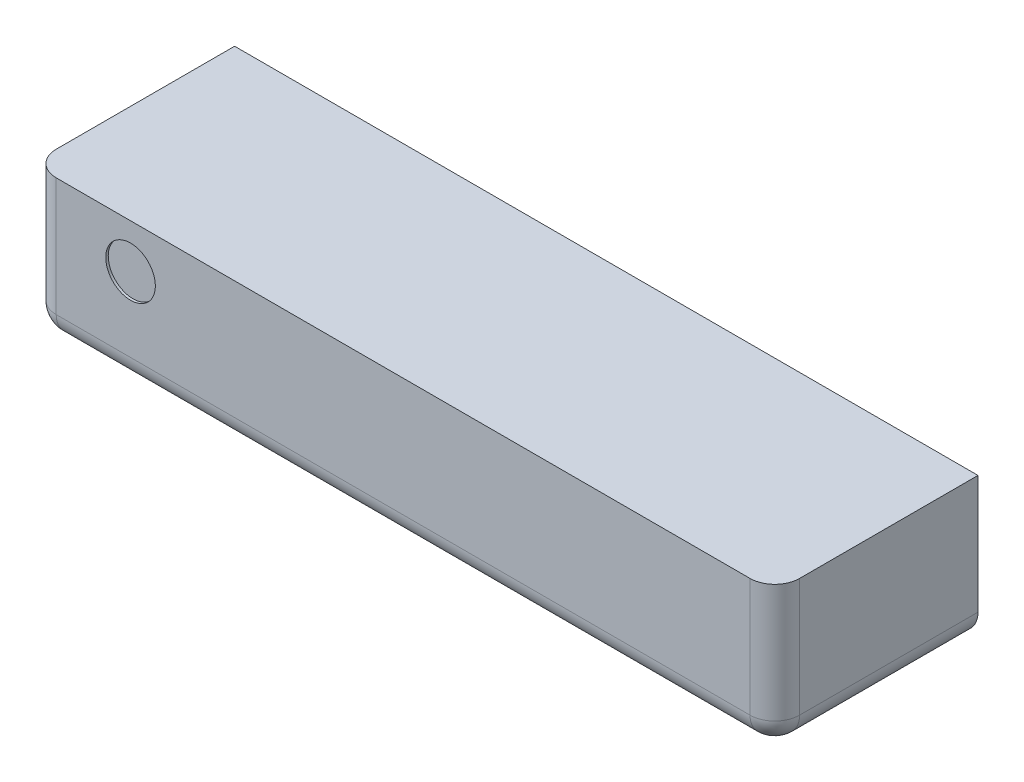
ISO-10303-21;
HEADER;
FILE_DESCRIPTION(('STEP AP214'),'2;1');
FILE_NAME('part.step','',(''),(''),'','','');
FILE_SCHEMA(('AUTOMOTIVE_DESIGN { 1 0 10303 214 1 1 1 1 }'));
ENDSEC;
DATA;
#1=APPLICATION_CONTEXT('core data for automotive mechanical design processes');
#2=APPLICATION_PROTOCOL_DEFINITION('international standard','automotive_design',2000,#1);
#3=PRODUCT_CONTEXT('',#1,'mechanical');
#4=PRODUCT('Part','Part','',(#3));
#5=PRODUCT_RELATED_PRODUCT_CATEGORY('part','',(#4));
#6=PRODUCT_DEFINITION_FORMATION('','',#4);
#7=PRODUCT_DEFINITION_CONTEXT('part definition',#1,'design');
#8=PRODUCT_DEFINITION('design','',#6,#7);
#9=PRODUCT_DEFINITION_SHAPE('','',#8);
#10=(LENGTH_UNIT() NAMED_UNIT(*) SI_UNIT(.MILLI.,.METRE.));
#11=(NAMED_UNIT(*) PLANE_ANGLE_UNIT() SI_UNIT($,.RADIAN.));
#12=(NAMED_UNIT(*) SI_UNIT($,.STERADIAN.) SOLID_ANGLE_UNIT());
#13=UNCERTAINTY_MEASURE_WITH_UNIT(LENGTH_MEASURE(1.E-05),#10,'distance_accuracy_value','');
#14=(GEOMETRIC_REPRESENTATION_CONTEXT(3) GLOBAL_UNCERTAINTY_ASSIGNED_CONTEXT((#13)) GLOBAL_UNIT_ASSIGNED_CONTEXT((#10,
#11,#12)) REPRESENTATION_CONTEXT('',''));
#15=CARTESIAN_POINT('',(0.,0.,0.));
#16=DIRECTION('',(0.,0.,1.));
#17=DIRECTION('',(1.,0.,0.));
#18=AXIS2_PLACEMENT_3D('',#15,#16,#17);
#19=CARTESIAN_POINT('',(-1.125,-1.51,0.2));
#20=DIRECTION('',(1.,0.,0.));
#21=DIRECTION('',(0.,1.,0.));
#22=AXIS2_PLACEMENT_3D('',#19,#20,#21);
#23=PLANE('',#22);
#24=DIRECTION('',(0.,1.,0.));
#25=VECTOR('',#24,1.);
#26=CARTESIAN_POINT('',(-1.125,-1.51,0.));
#27=LINE('',#26,#25);
#28=CARTESIAN_POINT('',(-1.125,-1.51,0.));
#29=VERTEX_POINT('',#28);
#30=CARTESIAN_POINT('',(-1.125,-1.26,0.));
#31=VERTEX_POINT('',#30);
#32=EDGE_CURVE('P0_E93',#29,#31,#27,.T.);
#33=ORIENTED_EDGE('',*,*,#32,.F.);
#34=DIRECTION('',(0.,0.,-1.));
#35=VECTOR('',#34,1.);
#36=CARTESIAN_POINT('',(-1.125,-1.51,0.2));
#37=LINE('',#36,#35);
#38=CARTESIAN_POINT('',(-1.125,-1.51,0.2));
#39=VERTEX_POINT('',#38);
#40=EDGE_CURVE('P0_E82',#39,#29,#37,.T.);
#41=ORIENTED_EDGE('',*,*,#40,.F.);
#42=DIRECTION('',(0.,1.,0.));
#43=VECTOR('',#42,1.);
#44=CARTESIAN_POINT('',(-1.125,-1.51,0.2));
#45=LINE('',#44,#43);
#46=CARTESIAN_POINT('',(-1.125,-1.26,0.2));
#47=VERTEX_POINT('',#46);
#48=EDGE_CURVE('P0_E102',#39,#47,#45,.T.);
#49=ORIENTED_EDGE('',*,*,#48,.T.);
#50=DIRECTION('',(0.,0.,-1.));
#51=VECTOR('',#50,1.);
#52=CARTESIAN_POINT('',(-1.125,-1.26,0.2));
#53=LINE('',#52,#51);
#54=EDGE_CURVE('P0_E11',#47,#31,#53,.T.);
#55=ORIENTED_EDGE('',*,*,#54,.T.);
#56=EDGE_LOOP('',(#33,#41,#49,#55));
#57=FACE_BOUND('',#56,.T.);
#58=ADVANCED_FACE('P0_F17',(#57),#23,.F.);
#59=CARTESIAN_POINT('',(-0.975,-1.26,0.2));
#60=DIRECTION('',(0.,0.,-1.));
#61=DIRECTION('',(-1.,0.,0.));
#62=AXIS2_PLACEMENT_3D('',#59,#60,#61);
#63=CYLINDRICAL_SURFACE('',#62,0.15);
#64=CARTESIAN_POINT('',(-0.975,-1.26,0.));
#65=DIRECTION('',(0.,0.,-1.));
#66=DIRECTION('',(1.,0.,0.));
#67=AXIS2_PLACEMENT_3D('',#64,#65,#66);
#68=CIRCLE('',#67,0.15);
#69=CARTESIAN_POINT('',(-0.825,-1.26,0.));
#70=VERTEX_POINT('',#69);
#71=EDGE_CURVE('P0_E76',#31,#70,#68,.T.);
#72=ORIENTED_EDGE('',*,*,#71,.F.);
#73=ORIENTED_EDGE('',*,*,#54,.F.);
#74=CARTESIAN_POINT('',(-0.975,-1.26,0.2));
#75=DIRECTION('',(0.,0.,-1.));
#76=DIRECTION('',(1.,0.,0.));
#77=AXIS2_PLACEMENT_3D('',#74,#75,#76);
#78=CIRCLE('',#77,0.15);
#79=CARTESIAN_POINT('',(-0.825,-1.26,0.2));
#80=VERTEX_POINT('',#79);
#81=EDGE_CURVE('P0_E79',#47,#80,#78,.T.);
#82=ORIENTED_EDGE('',*,*,#81,.T.);
#83=DIRECTION('',(0.,0.,-1.));
#84=VECTOR('',#83,1.);
#85=CARTESIAN_POINT('',(-0.825,-1.26,0.2));
#86=LINE('',#85,#84);
#87=EDGE_CURVE('P0_E20',#80,#70,#86,.T.);
#88=ORIENTED_EDGE('',*,*,#87,.T.);
#89=EDGE_LOOP('',(#72,#73,#82,#88));
#90=FACE_BOUND('',#89,.T.);
#91=ADVANCED_FACE('P0_F74',(#90),#63,.T.);
#92=CARTESIAN_POINT('',(-0.825,-1.51,0.2));
#93=DIRECTION('',(-1.,0.,0.));
#94=DIRECTION('',(0.,0.,1.));
#95=AXIS2_PLACEMENT_3D('',#92,#93,#94);
#96=PLANE('',#95);
#97=DIRECTION('',(0.,-1.,0.));
#98=VECTOR('',#97,1.);
#99=CARTESIAN_POINT('',(-0.825,-1.51,0.));
#100=LINE('',#99,#98);
#101=CARTESIAN_POINT('',(-0.825,-1.51,0.));
#102=VERTEX_POINT('',#101);
#103=EDGE_CURVE('P0_E84',#70,#102,#100,.T.);
#104=ORIENTED_EDGE('',*,*,#103,.F.);
#105=ORIENTED_EDGE('',*,*,#87,.F.);
#106=DIRECTION('',(0.,-1.,0.));
#107=VECTOR('',#106,1.);
#108=CARTESIAN_POINT('',(-0.825,-1.51,0.2));
#109=LINE('',#108,#107);
#110=CARTESIAN_POINT('',(-0.825,-1.51,0.2));
#111=VERTEX_POINT('',#110);
#112=EDGE_CURVE('P0_E109',#80,#111,#109,.T.);
#113=ORIENTED_EDGE('',*,*,#112,.T.);
#114=DIRECTION('',(0.,0.,-1.));
#115=VECTOR('',#114,1.);
#116=CARTESIAN_POINT('',(-0.825,-1.51,0.2));
#117=LINE('',#116,#115);
#118=EDGE_CURVE('P0_E49',#111,#102,#117,.T.);
#119=ORIENTED_EDGE('',*,*,#118,.T.);
#120=EDGE_LOOP('',(#104,#105,#113,#119));
#121=FACE_BOUND('',#120,.T.);
#122=ADVANCED_FACE('P0_F85',(#121),#96,.F.);
#123=CARTESIAN_POINT('',(-1.125,-1.51,0.2));
#124=DIRECTION('',(0.,1.,0.));
#125=DIRECTION('',(1.,0.,0.));
#126=AXIS2_PLACEMENT_3D('',#123,#124,#125);
#127=PLANE('',#126);
#128=DIRECTION('',(-1.,0.,0.));
#129=VECTOR('',#128,1.);
#130=CARTESIAN_POINT('',(-1.125,-1.51,0.));
#131=LINE('',#130,#129);
#132=EDGE_CURVE('P0_E89',#102,#29,#131,.T.);
#133=ORIENTED_EDGE('',*,*,#132,.F.);
#134=ORIENTED_EDGE('',*,*,#118,.F.);
#135=DIRECTION('',(-1.,0.,0.));
#136=VECTOR('',#135,1.);
#137=CARTESIAN_POINT('',(-1.125,-1.51,0.2));
#138=LINE('',#137,#136);
#139=EDGE_CURVE('P0_E104',#111,#39,#138,.T.);
#140=ORIENTED_EDGE('',*,*,#139,.T.);
#141=ORIENTED_EDGE('',*,*,#40,.T.);
#142=EDGE_LOOP('',(#133,#134,#140,#141));
#143=FACE_BOUND('',#142,.T.);
#144=ADVANCED_FACE('P0_F119',(#143),#127,.F.);
#145=CARTESIAN_POINT('',(-0.975,-1.26,0.2));
#146=DIRECTION('',(0.,0.,1.));
#147=DIRECTION('',(1.,0.,0.));
#148=AXIS2_PLACEMENT_3D('',#145,#146,#147);
#149=PLANE('',#148);
#150=ORIENTED_EDGE('',*,*,#48,.F.);
#151=ORIENTED_EDGE('',*,*,#139,.F.);
#152=ORIENTED_EDGE('',*,*,#112,.F.);
#153=ORIENTED_EDGE('',*,*,#81,.F.);
#154=EDGE_LOOP('',(#150,#151,#152,#153));
#155=FACE_BOUND('',#154,.T.);
#156=ADVANCED_FACE('P0_F124',(#155),#149,.T.);
#157=CARTESIAN_POINT('',(-0.975,-1.26,0.));
#158=DIRECTION('',(0.,0.,1.));
#159=DIRECTION('',(1.,0.,0.));
#160=AXIS2_PLACEMENT_3D('',#157,#158,#159);
#161=PLANE('',#160);
#162=ORIENTED_EDGE('',*,*,#32,.T.);
#163=ORIENTED_EDGE('',*,*,#71,.T.);
#164=ORIENTED_EDGE('',*,*,#103,.T.);
#165=ORIENTED_EDGE('',*,*,#132,.T.);
#166=EDGE_LOOP('',(#162,#163,#164,#165));
#167=FACE_BOUND('',#166,.T.);
#168=ADVANCED_FACE('P0_F91',(#167),#161,.F.);
#169=CLOSED_SHELL('',(#58,#91,#122,#144,#156,#168));
#170=MANIFOLD_SOLID_BREP('P0_B1',#169);
#171=CARTESIAN_POINT('',(-0.475,-1.51,0.2));
#172=DIRECTION('',(1.,0.,0.));
#173=DIRECTION('',(0.,1.,0.));
#174=AXIS2_PLACEMENT_3D('',#171,#172,#173);
#175=PLANE('',#174);
#176=DIRECTION('',(0.,1.,0.));
#177=VECTOR('',#176,1.);
#178=CARTESIAN_POINT('',(-0.475,-1.51,0.));
#179=LINE('',#178,#177);
#180=CARTESIAN_POINT('',(-0.475,-1.51,0.));
#181=VERTEX_POINT('',#180);
#182=CARTESIAN_POINT('',(-0.475,-1.26,0.));
#183=VERTEX_POINT('',#182);
#184=EDGE_CURVE('P1_E78',#181,#183,#179,.T.);
#185=ORIENTED_EDGE('',*,*,#184,.F.);
#186=DIRECTION('',(0.,0.,-1.));
#187=VECTOR('',#186,1.);
#188=CARTESIAN_POINT('',(-0.475,-1.51,0.2));
#189=LINE('',#188,#187);
#190=CARTESIAN_POINT('',(-0.475,-1.51,0.2));
#191=VERTEX_POINT('',#190);
#192=EDGE_CURVE('P1_E74',#191,#181,#189,.T.);
#193=ORIENTED_EDGE('',*,*,#192,.F.);
#194=DIRECTION('',(0.,1.,0.));
#195=VECTOR('',#194,1.);
#196=CARTESIAN_POINT('',(-0.475,-1.51,0.2));
#197=LINE('',#196,#195);
#198=CARTESIAN_POINT('',(-0.475,-1.26,0.2));
#199=VERTEX_POINT('',#198);
#200=EDGE_CURVE('P1_E76',#191,#199,#197,.T.);
#201=ORIENTED_EDGE('',*,*,#200,.T.);
#202=DIRECTION('',(0.,0.,-1.));
#203=VECTOR('',#202,1.);
#204=CARTESIAN_POINT('',(-0.475,-1.26,0.2));
#205=LINE('',#204,#203);
#206=EDGE_CURVE('P1_E11',#199,#183,#205,.T.);
#207=ORIENTED_EDGE('',*,*,#206,.T.);
#208=EDGE_LOOP('',(#185,#193,#201,#207));
#209=FACE_BOUND('',#208,.T.);
#210=ADVANCED_FACE('P1_F17',(#209),#175,.F.);
#211=CARTESIAN_POINT('',(-0.325,-1.26,0.2));
#212=DIRECTION('',(0.,0.,-1.));
#213=DIRECTION('',(-1.,0.,0.));
#214=AXIS2_PLACEMENT_3D('',#211,#212,#213);
#215=CYLINDRICAL_SURFACE('',#214,0.15);
#216=CARTESIAN_POINT('',(-0.325,-1.26,0.));
#217=DIRECTION('',(0.,0.,-1.));
#218=DIRECTION('',(1.,0.,0.));
#219=AXIS2_PLACEMENT_3D('',#216,#217,#218);
#220=CIRCLE('',#219,0.15);
#221=CARTESIAN_POINT('',(-0.175,-1.26,0.));
#222=VERTEX_POINT('',#221);
#223=EDGE_CURVE('P1_E105',#183,#222,#220,.T.);
#224=ORIENTED_EDGE('',*,*,#223,.F.);
#225=ORIENTED_EDGE('',*,*,#206,.F.);
#226=CARTESIAN_POINT('',(-0.325,-1.26,0.2));
#227=DIRECTION('',(0.,0.,-1.));
#228=DIRECTION('',(1.,0.,0.));
#229=AXIS2_PLACEMENT_3D('',#226,#227,#228);
#230=CIRCLE('',#229,0.15);
#231=CARTESIAN_POINT('',(-0.175,-1.26,0.2));
#232=VERTEX_POINT('',#231);
#233=EDGE_CURVE('P1_E92',#199,#232,#230,.T.);
#234=ORIENTED_EDGE('',*,*,#233,.T.);
#235=DIRECTION('',(0.,0.,-1.));
#236=VECTOR('',#235,1.);
#237=CARTESIAN_POINT('',(-0.175,-1.26,0.2));
#238=LINE('',#237,#236);
#239=EDGE_CURVE('P1_E25',#232,#222,#238,.T.);
#240=ORIENTED_EDGE('',*,*,#239,.T.);
#241=EDGE_LOOP('',(#224,#225,#234,#240));
#242=FACE_BOUND('',#241,.T.);
#243=ADVANCED_FACE('P1_F121',(#242),#215,.T.);
#244=CARTESIAN_POINT('',(-0.175,-1.51,0.2));
#245=DIRECTION('',(-1.,0.,0.));
#246=DIRECTION('',(0.,0.,1.));
#247=AXIS2_PLACEMENT_3D('',#244,#245,#246);
#248=PLANE('',#247);
#249=DIRECTION('',(0.,-1.,0.));
#250=VECTOR('',#249,1.);
#251=CARTESIAN_POINT('',(-0.175,-1.51,0.));
#252=LINE('',#251,#250);
#253=CARTESIAN_POINT('',(-0.175,-1.51,0.));
#254=VERTEX_POINT('',#253);
#255=EDGE_CURVE('P1_E101',#222,#254,#252,.T.);
#256=ORIENTED_EDGE('',*,*,#255,.F.);
#257=ORIENTED_EDGE('',*,*,#239,.F.);
#258=DIRECTION('',(0.,-1.,0.));
#259=VECTOR('',#258,1.);
#260=CARTESIAN_POINT('',(-0.175,-1.51,0.2));
#261=LINE('',#260,#259);
#262=CARTESIAN_POINT('',(-0.175,-1.51,0.2));
#263=VERTEX_POINT('',#262);
#264=EDGE_CURVE('P1_E88',#232,#263,#261,.T.);
#265=ORIENTED_EDGE('',*,*,#264,.T.);
#266=DIRECTION('',(0.,0.,-1.));
#267=VECTOR('',#266,1.);
#268=CARTESIAN_POINT('',(-0.175,-1.51,0.2));
#269=LINE('',#268,#267);
#270=EDGE_CURVE('P1_E51',#263,#254,#269,.T.);
#271=ORIENTED_EDGE('',*,*,#270,.T.);
#272=EDGE_LOOP('',(#256,#257,#265,#271));
#273=FACE_BOUND('',#272,.T.);
#274=ADVANCED_FACE('P1_F122',(#273),#248,.F.);
#275=CARTESIAN_POINT('',(-0.475,-1.51,0.2));
#276=DIRECTION('',(0.,1.,0.));
#277=DIRECTION('',(1.,0.,0.));
#278=AXIS2_PLACEMENT_3D('',#275,#276,#277);
#279=PLANE('',#278);
#280=DIRECTION('',(-1.,0.,0.));
#281=VECTOR('',#280,1.);
#282=CARTESIAN_POINT('',(-0.475,-1.51,0.));
#283=LINE('',#282,#281);
#284=EDGE_CURVE('P1_E94',#254,#181,#283,.T.);
#285=ORIENTED_EDGE('',*,*,#284,.F.);
#286=ORIENTED_EDGE('',*,*,#270,.F.);
#287=DIRECTION('',(-1.,0.,0.));
#288=VECTOR('',#287,1.);
#289=CARTESIAN_POINT('',(-0.475,-1.51,0.2));
#290=LINE('',#289,#288);
#291=EDGE_CURVE('P1_E83',#263,#191,#290,.T.);
#292=ORIENTED_EDGE('',*,*,#291,.T.);
#293=ORIENTED_EDGE('',*,*,#192,.T.);
#294=EDGE_LOOP('',(#285,#286,#292,#293));
#295=FACE_BOUND('',#294,.T.);
#296=ADVANCED_FACE('P1_F84',(#295),#279,.F.);
#297=CARTESIAN_POINT('',(-0.325,-1.26,0.2));
#298=DIRECTION('',(0.,0.,1.));
#299=DIRECTION('',(1.,0.,0.));
#300=AXIS2_PLACEMENT_3D('',#297,#298,#299);
#301=PLANE('',#300);
#302=ORIENTED_EDGE('',*,*,#200,.F.);
#303=ORIENTED_EDGE('',*,*,#291,.F.);
#304=ORIENTED_EDGE('',*,*,#264,.F.);
#305=ORIENTED_EDGE('',*,*,#233,.F.);
#306=EDGE_LOOP('',(#302,#303,#304,#305));
#307=FACE_BOUND('',#306,.T.);
#308=ADVANCED_FACE('P1_F91',(#307),#301,.T.);
#309=CARTESIAN_POINT('',(-0.325,-1.26,0.));
#310=DIRECTION('',(0.,0.,1.));
#311=DIRECTION('',(1.,0.,0.));
#312=AXIS2_PLACEMENT_3D('',#309,#310,#311);
#313=PLANE('',#312);
#314=ORIENTED_EDGE('',*,*,#184,.T.);
#315=ORIENTED_EDGE('',*,*,#223,.T.);
#316=ORIENTED_EDGE('',*,*,#255,.T.);
#317=ORIENTED_EDGE('',*,*,#284,.T.);
#318=EDGE_LOOP('',(#314,#315,#316,#317));
#319=FACE_BOUND('',#318,.T.);
#320=ADVANCED_FACE('P1_F124',(#319),#313,.F.);
#321=CLOSED_SHELL('',(#210,#243,#274,#296,#308,#320));
#322=MANIFOLD_SOLID_BREP('P1_B1',#321);
#323=CARTESIAN_POINT('',(0.475,-1.51,0.2));
#324=DIRECTION('',(-1.,0.,0.));
#325=DIRECTION('',(0.,0.,1.));
#326=AXIS2_PLACEMENT_3D('',#323,#324,#325);
#327=PLANE('',#326);
#328=DIRECTION('',(0.,1.,0.));
#329=VECTOR('',#328,1.);
#330=CARTESIAN_POINT('',(0.475,-1.51,0.));
#331=LINE('',#330,#329);
#332=CARTESIAN_POINT('',(0.475,-1.51,0.));
#333=VERTEX_POINT('',#332);
#334=CARTESIAN_POINT('',(0.475,-1.26,0.));
#335=VERTEX_POINT('',#334);
#336=EDGE_CURVE('P2_E82',#333,#335,#331,.T.);
#337=ORIENTED_EDGE('',*,*,#336,.T.);
#338=DIRECTION('',(0.,0.,-1.));
#339=VECTOR('',#338,1.);
#340=CARTESIAN_POINT('',(0.475,-1.26,0.2));
#341=LINE('',#340,#339);
#342=CARTESIAN_POINT('',(0.475,-1.26,0.2));
#343=VERTEX_POINT('',#342);
#344=EDGE_CURVE('P2_E11',#343,#335,#341,.T.);
#345=ORIENTED_EDGE('',*,*,#344,.F.);
#346=DIRECTION('',(0.,1.,0.));
#347=VECTOR('',#346,1.);
#348=CARTESIAN_POINT('',(0.475,-1.51,0.2));
#349=LINE('',#348,#347);
#350=CARTESIAN_POINT('',(0.475,-1.51,0.2));
#351=VERTEX_POINT('',#350);
#352=EDGE_CURVE('P2_E84',#351,#343,#349,.T.);
#353=ORIENTED_EDGE('',*,*,#352,.F.);
#354=DIRECTION('',(0.,0.,-1.));
#355=VECTOR('',#354,1.);
#356=CARTESIAN_POINT('',(0.475,-1.51,0.2));
#357=LINE('',#356,#355);
#358=EDGE_CURVE('P2_E64',#351,#333,#357,.T.);
#359=ORIENTED_EDGE('',*,*,#358,.T.);
#360=EDGE_LOOP('',(#337,#345,#353,#359));
#361=FACE_BOUND('',#360,.T.);
#362=ADVANCED_FACE('P2_F17',(#361),#327,.F.);
#363=CARTESIAN_POINT('',(0.325,-1.26,0.2));
#364=DIRECTION('',(0.,0.,-1.));
#365=DIRECTION('',(1.,0.,0.));
#366=AXIS2_PLACEMENT_3D('',#363,#364,#365);
#367=CYLINDRICAL_SURFACE('',#366,0.15);
#368=CARTESIAN_POINT('',(0.325,-1.26,0.));
#369=DIRECTION('',(0.,0.,1.));
#370=DIRECTION('',(-1.,0.,0.));
#371=AXIS2_PLACEMENT_3D('',#368,#369,#370);
#372=CIRCLE('',#371,0.15);
#373=CARTESIAN_POINT('',(0.175,-1.26,0.));
#374=VERTEX_POINT('',#373);
#375=EDGE_CURVE('P2_E98',#335,#374,#372,.T.);
#376=ORIENTED_EDGE('',*,*,#375,.T.);
#377=DIRECTION('',(0.,0.,-1.));
#378=VECTOR('',#377,1.);
#379=CARTESIAN_POINT('',(0.175,-1.26,0.2));
#380=LINE('',#379,#378);
#381=CARTESIAN_POINT('',(0.175,-1.26,0.2));
#382=VERTEX_POINT('',#381);
#383=EDGE_CURVE('P2_E21',#382,#374,#380,.T.);
#384=ORIENTED_EDGE('',*,*,#383,.F.);
#385=CARTESIAN_POINT('',(0.325,-1.26,0.2));
#386=DIRECTION('',(0.,0.,1.));
#387=DIRECTION('',(-1.,0.,0.));
#388=AXIS2_PLACEMENT_3D('',#385,#386,#387);
#389=CIRCLE('',#388,0.15);
#390=EDGE_CURVE('P2_E110',#343,#382,#389,.T.);
#391=ORIENTED_EDGE('',*,*,#390,.F.);
#392=ORIENTED_EDGE('',*,*,#344,.T.);
#393=EDGE_LOOP('',(#376,#384,#391,#392));
#394=FACE_BOUND('',#393,.T.);
#395=ADVANCED_FACE('P2_F19',(#394),#367,.T.);
#396=CARTESIAN_POINT('',(0.175,-1.51,0.2));
#397=DIRECTION('',(1.,0.,0.));
#398=DIRECTION('',(0.,1.,0.));
#399=AXIS2_PLACEMENT_3D('',#396,#397,#398);
#400=PLANE('',#399);
#401=DIRECTION('',(0.,-1.,0.));
#402=VECTOR('',#401,1.);
#403=CARTESIAN_POINT('',(0.175,-1.51,0.));
#404=LINE('',#403,#402);
#405=CARTESIAN_POINT('',(0.175,-1.51,0.));
#406=VERTEX_POINT('',#405);
#407=EDGE_CURVE('P2_E94',#374,#406,#404,.T.);
#408=ORIENTED_EDGE('',*,*,#407,.T.);
#409=DIRECTION('',(0.,0.,-1.));
#410=VECTOR('',#409,1.);
#411=CARTESIAN_POINT('',(0.175,-1.51,0.2));
#412=LINE('',#411,#410);
#413=CARTESIAN_POINT('',(0.175,-1.51,0.2));
#414=VERTEX_POINT('',#413);
#415=EDGE_CURVE('P2_E41',#414,#406,#412,.T.);
#416=ORIENTED_EDGE('',*,*,#415,.F.);
#417=DIRECTION('',(0.,-1.,0.));
#418=VECTOR('',#417,1.);
#419=CARTESIAN_POINT('',(0.175,-1.51,0.2));
#420=LINE('',#419,#418);
#421=EDGE_CURVE('P2_E114',#382,#414,#420,.T.);
#422=ORIENTED_EDGE('',*,*,#421,.F.);
#423=ORIENTED_EDGE('',*,*,#383,.T.);
#424=EDGE_LOOP('',(#408,#416,#422,#423));
#425=FACE_BOUND('',#424,.T.);
#426=ADVANCED_FACE('P2_F156',(#425),#400,.F.);
#427=CARTESIAN_POINT('',(0.475,-1.51,0.2));
#428=DIRECTION('',(0.,1.,0.));
#429=DIRECTION('',(1.,0.,0.));
#430=AXIS2_PLACEMENT_3D('',#427,#428,#429);
#431=PLANE('',#430);
#432=DIRECTION('',(1.,0.,0.));
#433=VECTOR('',#432,1.);
#434=CARTESIAN_POINT('',(0.475,-1.51,0.));
#435=LINE('',#434,#433);
#436=EDGE_CURVE('P2_E89',#406,#333,#435,.T.);
#437=ORIENTED_EDGE('',*,*,#436,.T.);
#438=ORIENTED_EDGE('',*,*,#358,.F.);
#439=DIRECTION('',(1.,0.,0.));
#440=VECTOR('',#439,1.);
#441=CARTESIAN_POINT('',(0.475,-1.51,0.2));
#442=LINE('',#441,#440);
#443=EDGE_CURVE('P2_E86',#414,#351,#442,.T.);
#444=ORIENTED_EDGE('',*,*,#443,.F.);
#445=ORIENTED_EDGE('',*,*,#415,.T.);
#446=EDGE_LOOP('',(#437,#438,#444,#445));
#447=FACE_BOUND('',#446,.T.);
#448=ADVANCED_FACE('P2_F90',(#447),#431,.F.);
#449=CARTESIAN_POINT('',(0.325,-1.26,0.2));
#450=DIRECTION('',(0.,0.,1.));
#451=DIRECTION('',(1.,0.,0.));
#452=AXIS2_PLACEMENT_3D('',#449,#450,#451);
#453=PLANE('',#452);
#454=ORIENTED_EDGE('',*,*,#352,.T.);
#455=ORIENTED_EDGE('',*,*,#390,.T.);
#456=ORIENTED_EDGE('',*,*,#421,.T.);
#457=ORIENTED_EDGE('',*,*,#443,.T.);
#458=EDGE_LOOP('',(#454,#455,#456,#457));
#459=FACE_BOUND('',#458,.T.);
#460=ADVANCED_FACE('P2_F135',(#459),#453,.T.);
#461=CARTESIAN_POINT('',(0.325,-1.26,0.));
#462=DIRECTION('',(0.,0.,1.));
#463=DIRECTION('',(1.,0.,0.));
#464=AXIS2_PLACEMENT_3D('',#461,#462,#463);
#465=PLANE('',#464);
#466=ORIENTED_EDGE('',*,*,#336,.F.);
#467=ORIENTED_EDGE('',*,*,#436,.F.);
#468=ORIENTED_EDGE('',*,*,#407,.F.);
#469=ORIENTED_EDGE('',*,*,#375,.F.);
#470=EDGE_LOOP('',(#466,#467,#468,#469));
#471=FACE_BOUND('',#470,.T.);
#472=ADVANCED_FACE('P2_F97',(#471),#465,.F.);
#473=CLOSED_SHELL('',(#362,#395,#426,#448,#460,#472));
#474=MANIFOLD_SOLID_BREP('P2_B1',#473);
#475=CARTESIAN_POINT('',(1.125,-1.51,0.2));
#476=DIRECTION('',(-1.,0.,0.));
#477=DIRECTION('',(0.,0.,1.));
#478=AXIS2_PLACEMENT_3D('',#475,#476,#477);
#479=PLANE('',#478);
#480=DIRECTION('',(0.,1.,0.));
#481=VECTOR('',#480,1.);
#482=CARTESIAN_POINT('',(1.125,-1.51,0.));
#483=LINE('',#482,#481);
#484=CARTESIAN_POINT('',(1.125,-1.51,0.));
#485=VERTEX_POINT('',#484);
#486=CARTESIAN_POINT('',(1.125,-1.26,0.));
#487=VERTEX_POINT('',#486);
#488=EDGE_CURVE('P3_E98',#485,#487,#483,.T.);
#489=ORIENTED_EDGE('',*,*,#488,.T.);
#490=DIRECTION('',(0.,0.,-1.));
#491=VECTOR('',#490,1.);
#492=CARTESIAN_POINT('',(1.125,-1.26,0.2));
#493=LINE('',#492,#491);
#494=CARTESIAN_POINT('',(1.125,-1.26,0.2));
#495=VERTEX_POINT('',#494);
#496=EDGE_CURVE('P3_E11',#495,#487,#493,.T.);
#497=ORIENTED_EDGE('',*,*,#496,.F.);
#498=DIRECTION('',(0.,1.,0.));
#499=VECTOR('',#498,1.);
#500=CARTESIAN_POINT('',(1.125,-1.51,0.2));
#501=LINE('',#500,#499);
#502=CARTESIAN_POINT('',(1.125,-1.51,0.2));
#503=VERTEX_POINT('',#502);
#504=EDGE_CURVE('P3_E88',#503,#495,#501,.T.);
#505=ORIENTED_EDGE('',*,*,#504,.F.);
#506=DIRECTION('',(0.,0.,-1.));
#507=VECTOR('',#506,1.);
#508=CARTESIAN_POINT('',(1.125,-1.51,0.2));
#509=LINE('',#508,#507);
#510=EDGE_CURVE('P3_E109',#503,#485,#509,.T.);
#511=ORIENTED_EDGE('',*,*,#510,.T.);
#512=EDGE_LOOP('',(#489,#497,#505,#511));
#513=FACE_BOUND('',#512,.T.);
#514=ADVANCED_FACE('P3_F17',(#513),#479,.F.);
#515=CARTESIAN_POINT('',(0.975,-1.26,0.2));
#516=DIRECTION('',(0.,0.,-1.));
#517=DIRECTION('',(1.,0.,0.));
#518=AXIS2_PLACEMENT_3D('',#515,#516,#517);
#519=CYLINDRICAL_SURFACE('',#518,0.15);
#520=CARTESIAN_POINT('',(0.975,-1.26,0.));
#521=DIRECTION('',(0.,0.,1.));
#522=DIRECTION('',(-1.,0.,0.));
#523=AXIS2_PLACEMENT_3D('',#520,#521,#522);
#524=CIRCLE('',#523,0.15);
#525=CARTESIAN_POINT('',(0.825,-1.26,0.));
#526=VERTEX_POINT('',#525);
#527=EDGE_CURVE('P3_E83',#487,#526,#524,.T.);
#528=ORIENTED_EDGE('',*,*,#527,.T.);
#529=DIRECTION('',(0.,0.,-1.));
#530=VECTOR('',#529,1.);
#531=CARTESIAN_POINT('',(0.825,-1.26,0.2));
#532=LINE('',#531,#530);
#533=CARTESIAN_POINT('',(0.825,-1.26,0.2));
#534=VERTEX_POINT('',#533);
#535=EDGE_CURVE('P3_E27',#534,#526,#532,.T.);
#536=ORIENTED_EDGE('',*,*,#535,.F.);
#537=CARTESIAN_POINT('',(0.975,-1.26,0.2));
#538=DIRECTION('',(0.,0.,1.));
#539=DIRECTION('',(-1.,0.,0.));
#540=AXIS2_PLACEMENT_3D('',#537,#538,#539);
#541=CIRCLE('',#540,0.15);
#542=EDGE_CURVE('P3_E104',#495,#534,#541,.T.);
#543=ORIENTED_EDGE('',*,*,#542,.F.);
#544=ORIENTED_EDGE('',*,*,#496,.T.);
#545=EDGE_LOOP('',(#528,#536,#543,#544));
#546=FACE_BOUND('',#545,.T.);
#547=ADVANCED_FACE('P3_F19',(#546),#519,.T.);
#548=CARTESIAN_POINT('',(0.825,-1.51,0.2));
#549=DIRECTION('',(1.,0.,0.));
#550=DIRECTION('',(0.,1.,0.));
#551=AXIS2_PLACEMENT_3D('',#548,#549,#550);
#552=PLANE('',#551);
#553=DIRECTION('',(0.,-1.,0.));
#554=VECTOR('',#553,1.);
#555=CARTESIAN_POINT('',(0.825,-1.51,0.));
#556=LINE('',#555,#554);
#557=CARTESIAN_POINT('',(0.825,-1.51,0.));
#558=VERTEX_POINT('',#557);
#559=EDGE_CURVE('P3_E75',#526,#558,#556,.T.);
#560=ORIENTED_EDGE('',*,*,#559,.T.);
#561=DIRECTION('',(0.,0.,-1.));
#562=VECTOR('',#561,1.);
#563=CARTESIAN_POINT('',(0.825,-1.51,0.2));
#564=LINE('',#563,#562);
#565=CARTESIAN_POINT('',(0.825,-1.51,0.2));
#566=VERTEX_POINT('',#565);
#567=EDGE_CURVE('P3_E21',#566,#558,#564,.T.);
#568=ORIENTED_EDGE('',*,*,#567,.F.);
#569=DIRECTION('',(0.,-1.,0.));
#570=VECTOR('',#569,1.);
#571=CARTESIAN_POINT('',(0.825,-1.51,0.2));
#572=LINE('',#571,#570);
#573=EDGE_CURVE('P3_E78',#534,#566,#572,.T.);
#574=ORIENTED_EDGE('',*,*,#573,.F.);
#575=ORIENTED_EDGE('',*,*,#535,.T.);
#576=EDGE_LOOP('',(#560,#568,#574,#575));
#577=FACE_BOUND('',#576,.T.);
#578=ADVANCED_FACE('P3_F73',(#577),#552,.F.);
#579=CARTESIAN_POINT('',(1.125,-1.51,0.2));
#580=DIRECTION('',(0.,1.,0.));
#581=DIRECTION('',(1.,0.,0.));
#582=AXIS2_PLACEMENT_3D('',#579,#580,#581);
#583=PLANE('',#582);
#584=DIRECTION('',(1.,0.,0.));
#585=VECTOR('',#584,1.);
#586=CARTESIAN_POINT('',(1.125,-1.51,0.));
#587=LINE('',#586,#585);
#588=EDGE_CURVE('P3_E92',#558,#485,#587,.T.);
#589=ORIENTED_EDGE('',*,*,#588,.T.);
#590=ORIENTED_EDGE('',*,*,#510,.F.);
#591=DIRECTION('',(1.,0.,0.));
#592=VECTOR('',#591,1.);
#593=CARTESIAN_POINT('',(1.125,-1.51,0.2));
#594=LINE('',#593,#592);
#595=EDGE_CURVE('P3_E108',#566,#503,#594,.T.);
#596=ORIENTED_EDGE('',*,*,#595,.F.);
#597=ORIENTED_EDGE('',*,*,#567,.T.);
#598=EDGE_LOOP('',(#589,#590,#596,#597));
#599=FACE_BOUND('',#598,.T.);
#600=ADVANCED_FACE('P3_F128',(#599),#583,.F.);
#601=CARTESIAN_POINT('',(0.975,-1.26,0.2));
#602=DIRECTION('',(0.,0.,1.));
#603=DIRECTION('',(1.,0.,0.));
#604=AXIS2_PLACEMENT_3D('',#601,#602,#603);
#605=PLANE('',#604);
#606=ORIENTED_EDGE('',*,*,#504,.T.);
#607=ORIENTED_EDGE('',*,*,#542,.T.);
#608=ORIENTED_EDGE('',*,*,#573,.T.);
#609=ORIENTED_EDGE('',*,*,#595,.T.);
#610=EDGE_LOOP('',(#606,#607,#608,#609));
#611=FACE_BOUND('',#610,.T.);
#612=ADVANCED_FACE('P3_F126',(#611),#605,.T.);
#613=CARTESIAN_POINT('',(0.975,-1.26,0.));
#614=DIRECTION('',(0.,0.,1.));
#615=DIRECTION('',(1.,0.,0.));
#616=AXIS2_PLACEMENT_3D('',#613,#614,#615);
#617=PLANE('',#616);
#618=ORIENTED_EDGE('',*,*,#488,.F.);
#619=ORIENTED_EDGE('',*,*,#588,.F.);
#620=ORIENTED_EDGE('',*,*,#559,.F.);
#621=ORIENTED_EDGE('',*,*,#527,.F.);
#622=EDGE_LOOP('',(#618,#619,#620,#621));
#623=FACE_BOUND('',#622,.T.);
#624=ADVANCED_FACE('P3_F90',(#623),#617,.F.);
#625=CLOSED_SHELL('',(#514,#547,#578,#600,#612,#624));
#626=MANIFOLD_SOLID_BREP('P3_B1',#625);
#627=CARTESIAN_POINT('',(13.302339481593,-0.922119876150143,5.39999695199399));
#628=DIRECTION('',(-1.25123693813419E-08,-1.,0.));
#629=DIRECTION('',(-1.,1.25123693813419E-08,0.));
#630=AXIS2_PLACEMENT_3D('',#627,#628,#629);
#631=PLANE('',#630);
#632=DIRECTION('',(-1.,1.25123693813419E-08,0.));
#633=VECTOR('',#632,1.);
#634=CARTESIAN_POINT('',(-1.15379024216617E-08,-0.922119709706357,0.03));
#635=LINE('',#634,#633);
#636=CARTESIAN_POINT('',(1.5,-0.922119728474912,0.03));
#637=VERTEX_POINT('',#636);
#638=CARTESIAN_POINT('',(-1.5,-0.922119690937804,0.03));
#639=VERTEX_POINT('',#638);
#640=EDGE_CURVE('P4_E28',#637,#639,#635,.T.);
#641=ORIENTED_EDGE('',*,*,#640,.T.);
#642=DIRECTION('',(0.,0.,-1.));
#643=VECTOR('',#642,1.);
#644=CARTESIAN_POINT('',(-1.5,-0.922119690937804,0.85));
#645=LINE('',#644,#643);
#646=CARTESIAN_POINT('',(-1.5,-0.922119690937804,0.75));
#647=VERTEX_POINT('',#646);
#648=EDGE_CURVE('P4_E104',#647,#639,#645,.T.);
#649=ORIENTED_EDGE('',*,*,#648,.F.);
#650=CARTESIAN_POINT('',(-1.4,-0.92211969218904,0.75));
#651=DIRECTION('',(1.25123696126383E-08,1.,0.));
#652=DIRECTION('',(1.,-1.25123696126383E-08,0.));
#653=AXIS2_PLACEMENT_3D('',#650,#651,#652);
#654=CIRCLE('',#653,0.1);
#655=CARTESIAN_POINT('',(-1.4,-0.922119709706358,0.85));
#656=VERTEX_POINT('',#655);
#657=EDGE_CURVE('P4_E420',#647,#656,#654,.T.);
#658=ORIENTED_EDGE('',*,*,#657,.T.);
#659=DIRECTION('',(-1.,1.25123693813419E-08,0.));
#660=VECTOR('',#659,1.);
#661=CARTESIAN_POINT('',(-1.15379024216617E-08,-0.922119709706357,0.85));
#662=LINE('',#661,#660);
#663=CARTESIAN_POINT('',(1.4,-0.922119727223675,0.85));
#664=VERTEX_POINT('',#663);
#665=EDGE_CURVE('P4_E11',#664,#656,#662,.T.);
#666=ORIENTED_EDGE('',*,*,#665,.F.);
#667=CARTESIAN_POINT('',(1.4,-0.922119727223675,0.75));
#668=DIRECTION('',(1.25123696126383E-08,1.,0.));
#669=DIRECTION('',(1.,-1.25123696126383E-08,0.));
#670=AXIS2_PLACEMENT_3D('',#667,#668,#669);
#671=CIRCLE('',#670,0.1);
#672=CARTESIAN_POINT('',(1.5,-0.922119728474912,0.75));
#673=VERTEX_POINT('',#672);
#674=EDGE_CURVE('P4_E434',#664,#673,#671,.T.);
#675=ORIENTED_EDGE('',*,*,#674,.T.);
#676=DIRECTION('',(0.,0.,1.));
#677=VECTOR('',#676,1.);
#678=CARTESIAN_POINT('',(1.5,-0.922119728474912,0.85));
#679=LINE('',#678,#677);
#680=EDGE_CURVE('P4_E151',#637,#673,#679,.T.);
#681=ORIENTED_EDGE('',*,*,#680,.F.);
#682=EDGE_LOOP('',(#641,#649,#658,#666,#675,#681));
#683=FACE_BOUND('',#682,.T.);
#684=ADVANCED_FACE('P4_F17',(#683),#631,.F.);
#685=CARTESIAN_POINT('',(0.,0.,0.85));
#686=DIRECTION('',(0.,0.,-1.));
#687=DIRECTION('',(0.,-1.,0.));
#688=AXIS2_PLACEMENT_3D('',#685,#686,#687);
#689=PLANE('',#688);
#690=CARTESIAN_POINT('',(-1.1,-1.1,0.85));
#691=DIRECTION('',(0.,0.,1.));
#692=DIRECTION('',(-1.,0.,0.));
#693=AXIS2_PLACEMENT_3D('',#690,#691,#692);
#694=CIRCLE('',#693,0.1);
#695=CARTESIAN_POINT('',(-1.2,-1.1,0.85));
#696=VERTEX_POINT('',#695);
#697=EDGE_CURVE('P4_E470',#696,#696,#694,.T.);
#698=ORIENTED_EDGE('',*,*,#697,.F.);
#699=EDGE_LOOP('',(#698));
#700=FACE_BOUND('',#699,.T.);
#701=DIRECTION('',(0.,1.,0.));
#702=VECTOR('',#701,1.);
#703=CARTESIAN_POINT('',(1.4,0.,0.85));
#704=LINE('',#703,#702);
#705=CARTESIAN_POINT('',(1.4,-1.4,0.85));
#706=VERTEX_POINT('',#705);
#707=EDGE_CURVE('P4_E431',#706,#664,#704,.T.);
#708=ORIENTED_EDGE('',*,*,#707,.T.);
#709=ORIENTED_EDGE('',*,*,#665,.T.);
#710=DIRECTION('',(0.,-1.,0.));
#711=VECTOR('',#710,1.);
#712=CARTESIAN_POINT('',(-1.4,0.,0.85));
#713=LINE('',#712,#711);
#714=CARTESIAN_POINT('',(-1.4,-1.4,0.85));
#715=VERTEX_POINT('',#714);
#716=EDGE_CURVE('P4_E122',#656,#715,#713,.T.);
#717=ORIENTED_EDGE('',*,*,#716,.T.);
#718=DIRECTION('',(1.,0.,0.));
#719=VECTOR('',#718,1.);
#720=CARTESIAN_POINT('',(0.,-1.4,0.85));
#721=LINE('',#720,#719);
#722=EDGE_CURVE('P4_E446',#715,#706,#721,.T.);
#723=ORIENTED_EDGE('',*,*,#722,.T.);
#724=EDGE_LOOP('',(#708,#709,#717,#723));
#725=FACE_BOUND('',#724,.T.);
#726=ADVANCED_FACE('P4_F154',(#700,#725),#689,.F.);
#727=CARTESIAN_POINT('',(0.,0.,0.03));
#728=DIRECTION('',(0.,0.,-1.));
#729=DIRECTION('',(0.,-1.,0.));
#730=AXIS2_PLACEMENT_3D('',#727,#728,#729);
#731=PLANE('',#730);
#732=ORIENTED_EDGE('',*,*,#640,.F.);
#733=DIRECTION('',(0.,1.,0.));
#734=VECTOR('',#733,1.);
#735=CARTESIAN_POINT('',(1.5,-1.5,0.03));
#736=LINE('',#735,#734);
#737=CARTESIAN_POINT('',(1.5,-1.4,0.03));
#738=VERTEX_POINT('',#737);
#739=EDGE_CURVE('P4_E21',#738,#637,#736,.T.);
#740=ORIENTED_EDGE('',*,*,#739,.F.);
#741=CARTESIAN_POINT('',(1.4,-1.4,0.03));
#742=DIRECTION('',(0.,0.,-1.));
#743=DIRECTION('',(-1.,0.,0.));
#744=AXIS2_PLACEMENT_3D('',#741,#742,#743);
#745=CIRCLE('',#744,0.1);
#746=CARTESIAN_POINT('',(1.4,-1.5,0.03));
#747=VERTEX_POINT('',#746);
#748=EDGE_CURVE('P4_E441',#738,#747,#745,.T.);
#749=ORIENTED_EDGE('',*,*,#748,.T.);
#750=DIRECTION('',(1.,0.,0.));
#751=VECTOR('',#750,1.);
#752=CARTESIAN_POINT('',(-1.5,-1.5,0.03));
#753=LINE('',#752,#751);
#754=CARTESIAN_POINT('',(-1.4,-1.5,0.03));
#755=VERTEX_POINT('',#754);
#756=EDGE_CURVE('P4_E115',#755,#747,#753,.T.);
#757=ORIENTED_EDGE('',*,*,#756,.F.);
#758=CARTESIAN_POINT('',(-1.4,-1.4,0.03));
#759=DIRECTION('',(0.,0.,-1.));
#760=DIRECTION('',(-1.,0.,0.));
#761=AXIS2_PLACEMENT_3D('',#758,#759,#760);
#762=CIRCLE('',#761,0.1);
#763=CARTESIAN_POINT('',(-1.5,-1.4,0.03));
#764=VERTEX_POINT('',#763);
#765=EDGE_CURVE('P4_E110',#755,#764,#762,.T.);
#766=ORIENTED_EDGE('',*,*,#765,.T.);
#767=DIRECTION('',(0.,-1.,0.));
#768=VECTOR('',#767,1.);
#769=CARTESIAN_POINT('',(-1.5,-1.5,0.03));
#770=LINE('',#769,#768);
#771=EDGE_CURVE('P4_E97',#639,#764,#770,.T.);
#772=ORIENTED_EDGE('',*,*,#771,.F.);
#773=EDGE_LOOP('',(#732,#740,#749,#757,#766,#772));
#774=FACE_BOUND('',#773,.T.);
#775=ADVANCED_FACE('P4_F118',(#774),#731,.T.);
#776=CARTESIAN_POINT('',(1.5,-1.5,0.85));
#777=DIRECTION('',(-1.,0.,0.));
#778=DIRECTION('',(0.,0.,1.));
#779=AXIS2_PLACEMENT_3D('',#776,#777,#778);
#780=PLANE('',#779);
#781=ORIENTED_EDGE('',*,*,#739,.T.);
#782=ORIENTED_EDGE('',*,*,#680,.T.);
#783=DIRECTION('',(0.,-1.,0.));
#784=VECTOR('',#783,1.);
#785=CARTESIAN_POINT('',(1.5,-1.5,0.75));
#786=LINE('',#785,#784);
#787=CARTESIAN_POINT('',(1.5,-1.4,0.75));
#788=VERTEX_POINT('',#787);
#789=EDGE_CURVE('P4_E426',#673,#788,#786,.T.);
#790=ORIENTED_EDGE('',*,*,#789,.T.);
#791=DIRECTION('',(0.,0.,-1.));
#792=VECTOR('',#791,1.);
#793=CARTESIAN_POINT('',(1.5,-1.4,0.85));
#794=LINE('',#793,#792);
#795=EDGE_CURVE('P4_E464',#788,#738,#794,.T.);
#796=ORIENTED_EDGE('',*,*,#795,.T.);
#797=EDGE_LOOP('',(#781,#782,#790,#796));
#798=FACE_BOUND('',#797,.T.);
#799=ADVANCED_FACE('P4_F194',(#798),#780,.F.);
#800=CARTESIAN_POINT('',(-1.5,-1.5,0.85));
#801=DIRECTION('',(1.,0.,0.));
#802=DIRECTION('',(0.,1.,0.));
#803=AXIS2_PLACEMENT_3D('',#800,#801,#802);
#804=PLANE('',#803);
#805=DIRECTION('',(0.,1.,0.));
#806=VECTOR('',#805,1.);
#807=CARTESIAN_POINT('',(-1.5,-1.5,0.75));
#808=LINE('',#807,#806);
#809=CARTESIAN_POINT('',(-1.5,-1.4,0.75));
#810=VERTEX_POINT('',#809);
#811=EDGE_CURVE('P4_E129',#810,#647,#808,.T.);
#812=ORIENTED_EDGE('',*,*,#811,.T.);
#813=ORIENTED_EDGE('',*,*,#648,.T.);
#814=ORIENTED_EDGE('',*,*,#771,.T.);
#815=DIRECTION('',(0.,0.,1.));
#816=VECTOR('',#815,1.);
#817=CARTESIAN_POINT('',(-1.5,-1.4,0.85));
#818=LINE('',#817,#816);
#819=EDGE_CURVE('P4_E101',#764,#810,#818,.T.);
#820=ORIENTED_EDGE('',*,*,#819,.T.);
#821=EDGE_LOOP('',(#812,#813,#814,#820));
#822=FACE_BOUND('',#821,.T.);
#823=ADVANCED_FACE('P4_F100',(#822),#804,.F.);
#824=CARTESIAN_POINT('',(-1.5,-1.5,0.85));
#825=DIRECTION('',(0.,1.,0.));
#826=DIRECTION('',(1.,0.,0.));
#827=AXIS2_PLACEMENT_3D('',#824,#825,#826);
#828=PLANE('',#827);
#829=ORIENTED_EDGE('',*,*,#756,.T.);
#830=DIRECTION('',(0.,0.,1.));
#831=VECTOR('',#830,1.);
#832=CARTESIAN_POINT('',(1.4,-1.5,0.85));
#833=LINE('',#832,#831);
#834=CARTESIAN_POINT('',(1.4,-1.5,0.75));
#835=VERTEX_POINT('',#834);
#836=EDGE_CURVE('P4_E438',#747,#835,#833,.T.);
#837=ORIENTED_EDGE('',*,*,#836,.T.);
#838=DIRECTION('',(-1.,0.,0.));
#839=VECTOR('',#838,1.);
#840=CARTESIAN_POINT('',(-1.5,-1.5,0.75));
#841=LINE('',#840,#839);
#842=CARTESIAN_POINT('',(-1.4,-1.5,0.75));
#843=VERTEX_POINT('',#842);
#844=EDGE_CURVE('P4_E459',#835,#843,#841,.T.);
#845=ORIENTED_EDGE('',*,*,#844,.T.);
#846=DIRECTION('',(0.,0.,-1.));
#847=VECTOR('',#846,1.);
#848=CARTESIAN_POINT('',(-1.4,-1.5,0.85));
#849=LINE('',#848,#847);
#850=EDGE_CURVE('P4_E116',#843,#755,#849,.T.);
#851=ORIENTED_EDGE('',*,*,#850,.T.);
#852=EDGE_LOOP('',(#829,#837,#845,#851));
#853=FACE_BOUND('',#852,.T.);
#854=ADVANCED_FACE('P4_F168',(#853),#828,.F.);
#855=CARTESIAN_POINT('',(-1.4,-1.4,0.85));
#856=DIRECTION('',(0.,0.,-1.));
#857=DIRECTION('',(-1.,0.,0.));
#858=AXIS2_PLACEMENT_3D('',#855,#856,#857);
#859=CYLINDRICAL_SURFACE('',#858,0.1);
#860=ORIENTED_EDGE('',*,*,#765,.F.);
#861=ORIENTED_EDGE('',*,*,#850,.F.);
#862=CARTESIAN_POINT('',(-1.4,-1.4,0.75));
#863=DIRECTION('',(0.,0.,1.));
#864=DIRECTION('',(1.,0.,0.));
#865=AXIS2_PLACEMENT_3D('',#862,#863,#864);
#866=CIRCLE('',#865,0.1);
#867=EDGE_CURVE('P4_E112',#810,#843,#866,.T.);
#868=ORIENTED_EDGE('',*,*,#867,.F.);
#869=ORIENTED_EDGE('',*,*,#819,.F.);
#870=EDGE_LOOP('',(#860,#861,#868,#869));
#871=FACE_BOUND('',#870,.T.);
#872=ADVANCED_FACE('P4_F19',(#871),#859,.T.);
#873=CARTESIAN_POINT('',(-1.4,0.,0.75));
#874=DIRECTION('',(0.,-1.,0.));
#875=DIRECTION('',(0.,0.,-1.));
#876=AXIS2_PLACEMENT_3D('',#873,#874,#875);
#877=CYLINDRICAL_SURFACE('',#876,0.1);
#878=ORIENTED_EDGE('',*,*,#657,.F.);
#879=ORIENTED_EDGE('',*,*,#811,.F.);
#880=CARTESIAN_POINT('',(-1.4,-1.4,0.75));
#881=DIRECTION('',(0.,-1.,0.));
#882=DIRECTION('',(0.,0.,-1.));
#883=AXIS2_PLACEMENT_3D('',#880,#881,#882);
#884=CIRCLE('',#883,0.1);
#885=EDGE_CURVE('P4_E442',#715,#810,#884,.T.);
#886=ORIENTED_EDGE('',*,*,#885,.F.);
#887=ORIENTED_EDGE('',*,*,#716,.F.);
#888=EDGE_LOOP('',(#878,#879,#886,#887));
#889=FACE_BOUND('',#888,.T.);
#890=ADVANCED_FACE('P4_F290',(#889),#877,.T.);
#891=CARTESIAN_POINT('',(1.4,0.,0.75));
#892=DIRECTION('',(0.,1.,0.));
#893=DIRECTION('',(0.,0.,1.));
#894=AXIS2_PLACEMENT_3D('',#891,#892,#893);
#895=CYLINDRICAL_SURFACE('',#894,0.1);
#896=ORIENTED_EDGE('',*,*,#674,.F.);
#897=ORIENTED_EDGE('',*,*,#707,.F.);
#898=CARTESIAN_POINT('',(1.4,-1.4,0.75));
#899=DIRECTION('',(0.,-1.,0.));
#900=DIRECTION('',(0.,0.,-1.));
#901=AXIS2_PLACEMENT_3D('',#898,#899,#900);
#902=CIRCLE('',#901,0.1);
#903=EDGE_CURVE('P4_E452',#788,#706,#902,.T.);
#904=ORIENTED_EDGE('',*,*,#903,.F.);
#905=ORIENTED_EDGE('',*,*,#789,.F.);
#906=EDGE_LOOP('',(#896,#897,#904,#905));
#907=FACE_BOUND('',#906,.T.);
#908=ADVANCED_FACE('P4_F253',(#907),#895,.T.);
#909=CARTESIAN_POINT('',(1.4,-1.4,0.85));
#910=DIRECTION('',(0.,0.,-1.));
#911=DIRECTION('',(-1.,0.,0.));
#912=AXIS2_PLACEMENT_3D('',#909,#910,#911);
#913=CYLINDRICAL_SURFACE('',#912,0.1);
#914=ORIENTED_EDGE('',*,*,#748,.F.);
#915=ORIENTED_EDGE('',*,*,#795,.F.);
#916=CARTESIAN_POINT('',(1.4,-1.4,0.75));
#917=DIRECTION('',(0.,0.,1.));
#918=DIRECTION('',(1.,0.,0.));
#919=AXIS2_PLACEMENT_3D('',#916,#917,#918);
#920=CIRCLE('',#919,0.1);
#921=EDGE_CURVE('P4_E450',#835,#788,#920,.T.);
#922=ORIENTED_EDGE('',*,*,#921,.F.);
#923=ORIENTED_EDGE('',*,*,#836,.F.);
#924=EDGE_LOOP('',(#914,#915,#922,#923));
#925=FACE_BOUND('',#924,.T.);
#926=ADVANCED_FACE('P4_F248',(#925),#913,.T.);
#927=CARTESIAN_POINT('',(-1.4,-1.4,0.75));
#928=DIRECTION('',(0.,0.,-1.));
#929=DIRECTION('',(1.,0.,0.));
#930=AXIS2_PLACEMENT_3D('',#927,#928,#929);
#931=SPHERICAL_SURFACE('',#930,0.1);
#932=ORIENTED_EDGE('',*,*,#885,.T.);
#933=ORIENTED_EDGE('',*,*,#867,.T.);
#934=CARTESIAN_POINT('',(-1.4,-1.4,0.75));
#935=DIRECTION('',(1.,0.,0.));
#936=DIRECTION('',(0.,0.,1.));
#937=AXIS2_PLACEMENT_3D('',#934,#935,#936);
#938=CIRCLE('',#937,0.1);
#939=EDGE_CURVE('P4_E473',#715,#843,#938,.T.);
#940=ORIENTED_EDGE('',*,*,#939,.F.);
#941=EDGE_LOOP('',(#932,#933,#940));
#942=FACE_BOUND('',#941,.T.);
#943=ADVANCED_FACE('P4_F240',(#942),#931,.T.);
#944=CARTESIAN_POINT('',(1.4,-1.4,0.75));
#945=DIRECTION('',(0.,0.,-1.));
#946=DIRECTION('',(1.,0.,0.));
#947=AXIS2_PLACEMENT_3D('',#944,#945,#946);
#948=SPHERICAL_SURFACE('',#947,0.1);
#949=ORIENTED_EDGE('',*,*,#921,.T.);
#950=ORIENTED_EDGE('',*,*,#903,.T.);
#951=CARTESIAN_POINT('',(1.4,-1.4,0.75));
#952=DIRECTION('',(-1.,0.,0.));
#953=DIRECTION('',(0.,0.,-1.));
#954=AXIS2_PLACEMENT_3D('',#951,#952,#953);
#955=CIRCLE('',#954,0.1);
#956=EDGE_CURVE('P4_E451',#835,#706,#955,.T.);
#957=ORIENTED_EDGE('',*,*,#956,.F.);
#958=EDGE_LOOP('',(#949,#950,#957));
#959=FACE_BOUND('',#958,.T.);
#960=ADVANCED_FACE('P4_F229',(#959),#948,.T.);
#961=CARTESIAN_POINT('',(0.,-1.4,0.75));
#962=DIRECTION('',(1.,0.,0.));
#963=DIRECTION('',(0.,0.,-1.));
#964=AXIS2_PLACEMENT_3D('',#961,#962,#963);
#965=CYLINDRICAL_SURFACE('',#964,0.1);
#966=ORIENTED_EDGE('',*,*,#939,.T.);
#967=ORIENTED_EDGE('',*,*,#844,.F.);
#968=ORIENTED_EDGE('',*,*,#956,.T.);
#969=ORIENTED_EDGE('',*,*,#722,.F.);
#970=EDGE_LOOP('',(#966,#967,#968,#969));
#971=FACE_BOUND('',#970,.T.);
#972=ADVANCED_FACE('P4_F217',(#971),#965,.T.);
#973=CARTESIAN_POINT('',(-1.1,-1.1,0.85));
#974=DIRECTION('',(0.,0.,-1.));
#975=DIRECTION('',(-1.,0.,0.));
#976=AXIS2_PLACEMENT_3D('',#973,#974,#975);
#977=CYLINDRICAL_SURFACE('',#976,0.1);
#978=CARTESIAN_POINT('',(-1.1,-1.1,0.84));
#979=DIRECTION('',(0.,0.,1.));
#980=DIRECTION('',(1.,0.,0.));
#981=AXIS2_PLACEMENT_3D('',#978,#979,#980);
#982=CIRCLE('',#981,0.1);
#983=CARTESIAN_POINT('',(-1.,-1.1,0.84));
#984=VERTEX_POINT('',#983);
#985=EDGE_CURVE('P4_E474',#984,#984,#982,.T.);
#986=ORIENTED_EDGE('',*,*,#985,.F.);
#987=EDGE_LOOP('',(#986));
#988=FACE_BOUND('',#987,.T.);
#989=ORIENTED_EDGE('',*,*,#697,.T.);
#990=EDGE_LOOP('',(#989));
#991=FACE_BOUND('',#990,.T.);
#992=ADVANCED_FACE('P4_F186',(#988,#991),#977,.F.);
#993=CARTESIAN_POINT('',(0.,0.,0.84));
#994=DIRECTION('',(0.,0.,-1.));
#995=DIRECTION('',(0.,-1.,0.));
#996=AXIS2_PLACEMENT_3D('',#993,#994,#995);
#997=PLANE('',#996);
#998=ORIENTED_EDGE('',*,*,#985,.T.);
#999=EDGE_LOOP('',(#998));
#1000=FACE_BOUND('',#999,.T.);
#1001=ADVANCED_FACE('P4_F181',(#1000),#997,.F.);
#1002=CLOSED_SHELL('',(#684,#726,#775,#799,#823,#854,#872,#890,#908,#926,#943,#960,#972,#992,#1001));
#1003=MANIFOLD_SOLID_BREP('P4_B1',#1002);
#1004=ADVANCED_BREP_SHAPE_REPRESENTATION('',(#18,#170,#322,#474,#626,#1003),#14);
#1005=SHAPE_DEFINITION_REPRESENTATION(#9,#1004);
ENDSEC;
END-ISO-10303-21;
